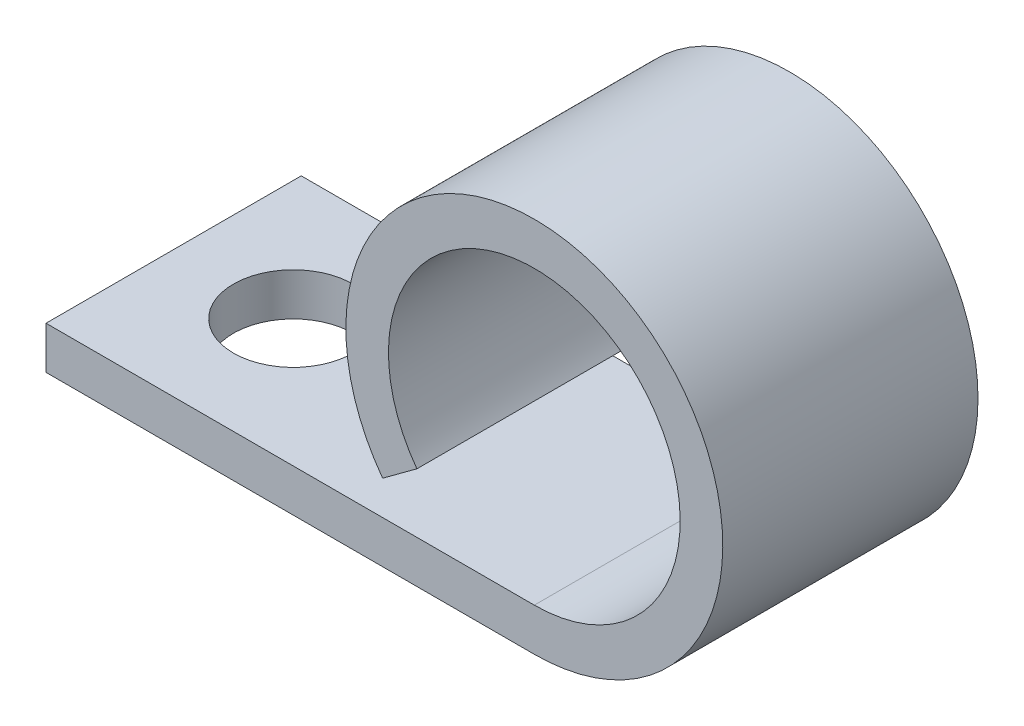
ISO-10303-21;
HEADER;
FILE_DESCRIPTION(('STEP AP214'),'2;1');
FILE_NAME('part.step','',(''),(''),'','','');
FILE_SCHEMA(('AUTOMOTIVE_DESIGN { 1 0 10303 214 1 1 1 1 }'));
ENDSEC;
DATA;
#1=APPLICATION_CONTEXT('core data for automotive mechanical design processes');
#2=APPLICATION_PROTOCOL_DEFINITION('international standard','automotive_design',2000,#1);
#3=PRODUCT_CONTEXT('',#1,'mechanical');
#4=PRODUCT('Part','Part','',(#3));
#5=PRODUCT_RELATED_PRODUCT_CATEGORY('part','',(#4));
#6=PRODUCT_DEFINITION_FORMATION('','',#4);
#7=PRODUCT_DEFINITION_CONTEXT('part definition',#1,'design');
#8=PRODUCT_DEFINITION('design','',#6,#7);
#9=PRODUCT_DEFINITION_SHAPE('','',#8);
#10=(LENGTH_UNIT() NAMED_UNIT(*) SI_UNIT(.MILLI.,.METRE.));
#11=(NAMED_UNIT(*) PLANE_ANGLE_UNIT() SI_UNIT($,.RADIAN.));
#12=(NAMED_UNIT(*) SI_UNIT($,.STERADIAN.) SOLID_ANGLE_UNIT());
#13=UNCERTAINTY_MEASURE_WITH_UNIT(LENGTH_MEASURE(1.E-05),#10,'distance_accuracy_value','');
#14=(GEOMETRIC_REPRESENTATION_CONTEXT(3) GLOBAL_UNCERTAINTY_ASSIGNED_CONTEXT((#13)) GLOBAL_UNIT_ASSIGNED_CONTEXT((#10,
#11,#12)) REPRESENTATION_CONTEXT('',''));
#15=CARTESIAN_POINT('',(0.,0.,0.));
#16=DIRECTION('',(0.,0.,1.));
#17=DIRECTION('',(1.,0.,0.));
#18=AXIS2_PLACEMENT_3D('',#15,#16,#17);
#19=CARTESIAN_POINT('',(-21.2598,-8.2042,5.55625));
#20=DIRECTION('',(1.,0.,0.));
#21=DIRECTION('',(0.,0.,-1.));
#22=AXIS2_PLACEMENT_3D('',#19,#20,#21);
#23=PLANE('',#22);
#24=DIRECTION('',(0.,-1.,0.));
#25=VECTOR('',#24,1.);
#26=CARTESIAN_POINT('',(-21.2598,-8.2042,-5.55625));
#27=LINE('',#26,#25);
#28=CARTESIAN_POINT('',(-21.2598,-6.35,-5.55625));
#29=VERTEX_POINT('',#28);
#30=CARTESIAN_POINT('',(-21.2598,-8.2042,-5.55625));
#31=VERTEX_POINT('',#30);
#32=EDGE_CURVE('E116',#29,#31,#27,.T.);
#33=ORIENTED_EDGE('',*,*,#32,.T.);
#34=DIRECTION('',(0.,0.,-1.));
#35=VECTOR('',#34,1.);
#36=CARTESIAN_POINT('',(-21.2598,-8.2042,5.55625));
#37=LINE('',#36,#35);
#38=CARTESIAN_POINT('',(-21.2598,-8.2042,5.55625));
#39=VERTEX_POINT('',#38);
#40=EDGE_CURVE('E11',#39,#31,#37,.T.);
#41=ORIENTED_EDGE('',*,*,#40,.F.);
#42=DIRECTION('',(0.,-1.,0.));
#43=VECTOR('',#42,1.);
#44=CARTESIAN_POINT('',(-21.2598,-8.2042,5.55625));
#45=LINE('',#44,#43);
#46=CARTESIAN_POINT('',(-21.2598,-6.35,5.55625));
#47=VERTEX_POINT('',#46);
#48=EDGE_CURVE('E127',#47,#39,#45,.T.);
#49=ORIENTED_EDGE('',*,*,#48,.F.);
#50=DIRECTION('',(0.,0.,-1.));
#51=VECTOR('',#50,1.);
#52=CARTESIAN_POINT('',(-21.2598,-6.35,5.55625));
#53=LINE('',#52,#51);
#54=EDGE_CURVE('E112',#47,#29,#53,.T.);
#55=ORIENTED_EDGE('',*,*,#54,.T.);
#56=EDGE_LOOP('',(#33,#41,#49,#55));
#57=FACE_BOUND('',#56,.T.);
#58=ADVANCED_FACE('F32',(#57),#23,.F.);
#59=CARTESIAN_POINT('',(-21.2598,-8.2042,5.55625));
#60=DIRECTION('',(0.,1.,0.));
#61=DIRECTION('',(0.,0.,1.));
#62=AXIS2_PLACEMENT_3D('',#59,#60,#61);
#63=PLANE('',#62);
#64=CARTESIAN_POINT('',(-16.0528,-8.2042,0.));
#65=DIRECTION('',(0.,1.,0.));
#66=DIRECTION('',(0.,0.,1.));
#67=AXIS2_PLACEMENT_3D('',#64,#65,#66);
#68=CIRCLE('',#67,2.6035);
#69=CARTESIAN_POINT('',(-16.0528,-8.2042,2.6035));
#70=VERTEX_POINT('',#69);
#71=EDGE_CURVE('E120',#70,#70,#68,.T.);
#72=ORIENTED_EDGE('',*,*,#71,.T.);
#73=EDGE_LOOP('',(#72));
#74=FACE_BOUND('',#73,.T.);
#75=DIRECTION('',(1.,0.,0.));
#76=VECTOR('',#75,1.);
#77=CARTESIAN_POINT('',(-21.2598,-8.2042,-5.55625));
#78=LINE('',#77,#76);
#79=CARTESIAN_POINT('',(0.,-8.2042,-5.55625));
#80=VERTEX_POINT('',#79);
#81=EDGE_CURVE('E119',#31,#80,#78,.T.);
#82=ORIENTED_EDGE('',*,*,#81,.T.);
#83=DIRECTION('',(0.,0.,-1.));
#84=VECTOR('',#83,1.);
#85=CARTESIAN_POINT('',(0.,-8.2042,5.55625));
#86=LINE('',#85,#84);
#87=CARTESIAN_POINT('',(0.,-8.2042,5.55625));
#88=VERTEX_POINT('',#87);
#89=EDGE_CURVE('E40',#88,#80,#86,.T.);
#90=ORIENTED_EDGE('',*,*,#89,.F.);
#91=DIRECTION('',(1.,0.,0.));
#92=VECTOR('',#91,1.);
#93=CARTESIAN_POINT('',(-21.2598,-8.2042,5.55625));
#94=LINE('',#93,#92);
#95=EDGE_CURVE('E85',#39,#88,#94,.T.);
#96=ORIENTED_EDGE('',*,*,#95,.F.);
#97=ORIENTED_EDGE('',*,*,#40,.T.);
#98=EDGE_LOOP('',(#82,#90,#96,#97));
#99=FACE_BOUND('',#98,.T.);
#100=ADVANCED_FACE('F153',(#74,#99),#63,.F.);
#101=CARTESIAN_POINT('',(0.,0.,5.55625));
#102=DIRECTION('',(0.,0.,-1.));
#103=DIRECTION('',(-1.,0.,0.));
#104=AXIS2_PLACEMENT_3D('',#101,#102,#103);
#105=CYLINDRICAL_SURFACE('',#104,8.2042);
#106=CARTESIAN_POINT('',(0.,0.,-5.55625));
#107=DIRECTION('',(0.,0.,1.));
#108=DIRECTION('',(1.,0.,0.));
#109=AXIS2_PLACEMENT_3D('',#106,#107,#108);
#110=CIRCLE('',#109,8.2042);
#111=CARTESIAN_POINT('',(-6.60490066166025,-4.86664,-5.55625));
#112=VERTEX_POINT('',#111);
#113=EDGE_CURVE('E122',#80,#112,#110,.T.);
#114=ORIENTED_EDGE('',*,*,#113,.T.);
#115=DIRECTION('',(0.,0.,-1.));
#116=VECTOR('',#115,1.);
#117=CARTESIAN_POINT('',(-6.60490066166025,-4.86664,5.55625));
#118=LINE('',#117,#116);
#119=CARTESIAN_POINT('',(-6.60490066166025,-4.86664,5.55625));
#120=VERTEX_POINT('',#119);
#121=EDGE_CURVE('E107',#120,#112,#118,.T.);
#122=ORIENTED_EDGE('',*,*,#121,.F.);
#123=CARTESIAN_POINT('',(0.,0.,5.55625));
#124=DIRECTION('',(0.,0.,1.));
#125=DIRECTION('',(1.,0.,0.));
#126=AXIS2_PLACEMENT_3D('',#123,#124,#125);
#127=CIRCLE('',#126,8.2042);
#128=EDGE_CURVE('E98',#88,#120,#127,.T.);
#129=ORIENTED_EDGE('',*,*,#128,.F.);
#130=ORIENTED_EDGE('',*,*,#89,.T.);
#131=EDGE_LOOP('',(#114,#122,#129,#130));
#132=FACE_BOUND('',#131,.T.);
#133=ADVANCED_FACE('F133',(#132),#105,.T.);
#134=CARTESIAN_POINT('',(-6.60490066166025,-4.86664,5.55625));
#135=DIRECTION('',(-0.593188854489165,0.805063340930285,0.));
#136=DIRECTION('',(-0.805063340930285,-0.593188854489165,0.));
#137=AXIS2_PLACEMENT_3D('',#134,#135,#136);
#138=PLANE('',#137);
#139=DIRECTION('',(0.805063340930285,0.593188854489165,0.));
#140=VECTOR('',#139,1.);
#141=CARTESIAN_POINT('',(-6.60490066166025,-4.86664,-5.55625));
#142=LINE('',#141,#140);
#143=CARTESIAN_POINT('',(-5.11215221490732,-3.76674922600619,-5.55625));
#144=VERTEX_POINT('',#143);
#145=EDGE_CURVE('E106',#112,#144,#142,.T.);
#146=ORIENTED_EDGE('',*,*,#145,.T.);
#147=DIRECTION('',(0.,0.,-1.));
#148=VECTOR('',#147,1.);
#149=CARTESIAN_POINT('',(-5.11215221490732,-3.76674922600619,5.55625));
#150=LINE('',#149,#148);
#151=CARTESIAN_POINT('',(-5.11215221490732,-3.76674922600619,5.55625));
#152=VERTEX_POINT('',#151);
#153=EDGE_CURVE('E103',#152,#144,#150,.T.);
#154=ORIENTED_EDGE('',*,*,#153,.F.);
#155=DIRECTION('',(0.805063340930285,0.593188854489165,0.));
#156=VECTOR('',#155,1.);
#157=CARTESIAN_POINT('',(-6.60490066166025,-4.86664,5.55625));
#158=LINE('',#157,#156);
#159=EDGE_CURVE('E92',#120,#152,#158,.T.);
#160=ORIENTED_EDGE('',*,*,#159,.F.);
#161=ORIENTED_EDGE('',*,*,#121,.T.);
#162=EDGE_LOOP('',(#146,#154,#160,#161));
#163=FACE_BOUND('',#162,.T.);
#164=ADVANCED_FACE('F104',(#163),#138,.F.);
#165=CARTESIAN_POINT('',(0.,0.,5.55625));
#166=DIRECTION('',(0.,0.,-1.));
#167=DIRECTION('',(-1.,0.,0.));
#168=AXIS2_PLACEMENT_3D('',#165,#166,#167);
#169=CYLINDRICAL_SURFACE('',#168,6.35);
#170=CARTESIAN_POINT('',(0.,0.,-5.55625));
#171=DIRECTION('',(0.,0.,-1.));
#172=DIRECTION('',(1.,0.,0.));
#173=AXIS2_PLACEMENT_3D('',#170,#171,#172);
#174=CIRCLE('',#173,6.35);
#175=CARTESIAN_POINT('',(0.,-6.35,-5.55625));
#176=VERTEX_POINT('',#175);
#177=EDGE_CURVE('E71',#144,#176,#174,.T.);
#178=ORIENTED_EDGE('',*,*,#177,.T.);
#179=DIRECTION('',(0.,0.,-1.));
#180=VECTOR('',#179,1.);
#181=CARTESIAN_POINT('',(0.,-6.35,5.55625));
#182=LINE('',#181,#180);
#183=CARTESIAN_POINT('',(0.,-6.35,5.55625));
#184=VERTEX_POINT('',#183);
#185=EDGE_CURVE('E108',#184,#176,#182,.T.);
#186=ORIENTED_EDGE('',*,*,#185,.F.);
#187=CARTESIAN_POINT('',(0.,0.,5.55625));
#188=DIRECTION('',(0.,0.,-1.));
#189=DIRECTION('',(1.,0.,0.));
#190=AXIS2_PLACEMENT_3D('',#187,#188,#189);
#191=CIRCLE('',#190,6.35);
#192=EDGE_CURVE('E96',#152,#184,#191,.T.);
#193=ORIENTED_EDGE('',*,*,#192,.F.);
#194=ORIENTED_EDGE('',*,*,#153,.T.);
#195=EDGE_LOOP('',(#178,#186,#193,#194));
#196=FACE_BOUND('',#195,.T.);
#197=ADVANCED_FACE('F110',(#196),#169,.F.);
#198=CARTESIAN_POINT('',(-21.2598,-6.35,5.55625));
#199=DIRECTION('',(0.,-1.,0.));
#200=DIRECTION('',(0.,0.,-1.));
#201=AXIS2_PLACEMENT_3D('',#198,#199,#200);
#202=PLANE('',#201);
#203=CARTESIAN_POINT('',(-16.0528,-6.35,0.));
#204=DIRECTION('',(0.,1.,0.));
#205=DIRECTION('',(0.,0.,1.));
#206=AXIS2_PLACEMENT_3D('',#203,#204,#205);
#207=CIRCLE('',#206,2.6035);
#208=CARTESIAN_POINT('',(-16.0528,-6.35,2.6035));
#209=VERTEX_POINT('',#208);
#210=EDGE_CURVE('E213',#209,#209,#207,.T.);
#211=ORIENTED_EDGE('',*,*,#210,.F.);
#212=EDGE_LOOP('',(#211));
#213=FACE_BOUND('',#212,.T.);
#214=DIRECTION('',(-1.,0.,0.));
#215=VECTOR('',#214,1.);
#216=CARTESIAN_POINT('',(-21.2598,-6.35,-5.55625));
#217=LINE('',#216,#215);
#218=EDGE_CURVE('E77',#176,#29,#217,.T.);
#219=ORIENTED_EDGE('',*,*,#218,.T.);
#220=ORIENTED_EDGE('',*,*,#54,.F.);
#221=DIRECTION('',(-1.,0.,0.));
#222=VECTOR('',#221,1.);
#223=CARTESIAN_POINT('',(-21.2598,-6.35,5.55625));
#224=LINE('',#223,#222);
#225=EDGE_CURVE('E48',#184,#47,#224,.T.);
#226=ORIENTED_EDGE('',*,*,#225,.F.);
#227=ORIENTED_EDGE('',*,*,#185,.T.);
#228=EDGE_LOOP('',(#219,#220,#226,#227));
#229=FACE_BOUND('',#228,.T.);
#230=ADVANCED_FACE('F140',(#213,#229),#202,.F.);
#231=CARTESIAN_POINT('',(0.,0.,5.55625));
#232=DIRECTION('',(0.,0.,1.));
#233=DIRECTION('',(1.,0.,0.));
#234=AXIS2_PLACEMENT_3D('',#231,#232,#233);
#235=PLANE('',#234);
#236=ORIENTED_EDGE('',*,*,#48,.T.);
#237=ORIENTED_EDGE('',*,*,#95,.T.);
#238=ORIENTED_EDGE('',*,*,#128,.T.);
#239=ORIENTED_EDGE('',*,*,#159,.T.);
#240=ORIENTED_EDGE('',*,*,#192,.T.);
#241=ORIENTED_EDGE('',*,*,#225,.T.);
#242=EDGE_LOOP('',(#236,#237,#238,#239,#240,#241));
#243=FACE_BOUND('',#242,.T.);
#244=ADVANCED_FACE('F94',(#243),#235,.T.);
#245=CARTESIAN_POINT('',(0.,0.,-5.55625));
#246=DIRECTION('',(0.,0.,1.));
#247=DIRECTION('',(1.,0.,0.));
#248=AXIS2_PLACEMENT_3D('',#245,#246,#247);
#249=PLANE('',#248);
#250=ORIENTED_EDGE('',*,*,#32,.F.);
#251=ORIENTED_EDGE('',*,*,#218,.F.);
#252=ORIENTED_EDGE('',*,*,#177,.F.);
#253=ORIENTED_EDGE('',*,*,#145,.F.);
#254=ORIENTED_EDGE('',*,*,#113,.F.);
#255=ORIENTED_EDGE('',*,*,#81,.F.);
#256=EDGE_LOOP('',(#250,#251,#252,#253,#254,#255));
#257=FACE_BOUND('',#256,.T.);
#258=ADVANCED_FACE('F136',(#257),#249,.F.);
#259=CARTESIAN_POINT('',(-16.0528,-8.2042,0.));
#260=DIRECTION('',(0.,1.,0.));
#261=DIRECTION('',(0.,0.,1.));
#262=AXIS2_PLACEMENT_3D('',#259,#260,#261);
#263=CYLINDRICAL_SURFACE('',#262,2.6035);
#264=ORIENTED_EDGE('',*,*,#71,.F.);
#265=EDGE_LOOP('',(#264));
#266=FACE_BOUND('',#265,.T.);
#267=ORIENTED_EDGE('',*,*,#210,.T.);
#268=EDGE_LOOP('',(#267));
#269=FACE_BOUND('',#268,.T.);
#270=ADVANCED_FACE('F188',(#266,#269),#263,.F.);
#271=CLOSED_SHELL('',(#58,#100,#133,#164,#197,#230,#244,#258,#270));
#272=MANIFOLD_SOLID_BREP('B2',#271);
#273=ADVANCED_BREP_SHAPE_REPRESENTATION('',(#18,#272),#14);
#274=SHAPE_DEFINITION_REPRESENTATION(#9,#273);
ENDSEC;
END-ISO-10303-21;
